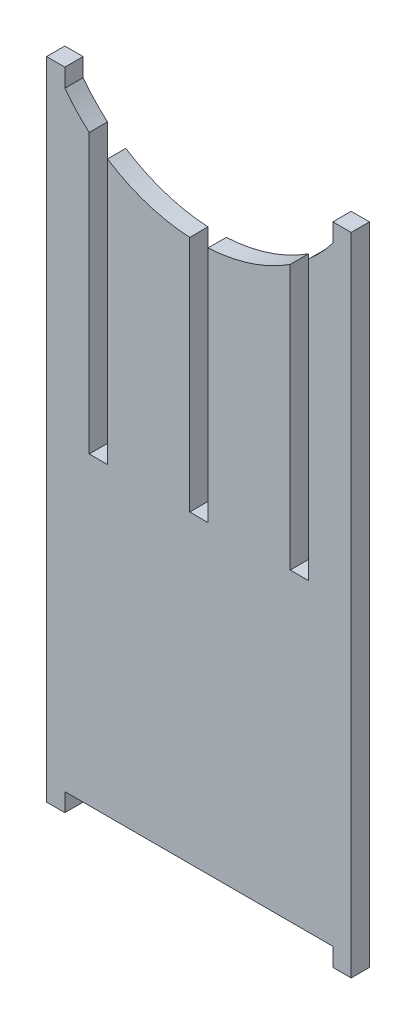
ISO-10303-21;
HEADER;
FILE_DESCRIPTION(('STEP AP214'),'2;1');
FILE_NAME('part.step','',(''),(''),'','','');
FILE_SCHEMA(('AUTOMOTIVE_DESIGN { 1 0 10303 214 1 1 1 1 }'));
ENDSEC;
DATA;
#1=APPLICATION_CONTEXT('core data for automotive mechanical design processes');
#2=APPLICATION_PROTOCOL_DEFINITION('international standard','automotive_design',2000,#1);
#3=PRODUCT_CONTEXT('',#1,'mechanical');
#4=PRODUCT('Part','Part','',(#3));
#5=PRODUCT_RELATED_PRODUCT_CATEGORY('part','',(#4));
#6=PRODUCT_DEFINITION_FORMATION('','',#4);
#7=PRODUCT_DEFINITION_CONTEXT('part definition',#1,'design');
#8=PRODUCT_DEFINITION('design','',#6,#7);
#9=PRODUCT_DEFINITION_SHAPE('','',#8);
#10=(LENGTH_UNIT() NAMED_UNIT(*) SI_UNIT(.MILLI.,.METRE.));
#11=(NAMED_UNIT(*) PLANE_ANGLE_UNIT() SI_UNIT($,.RADIAN.));
#12=(NAMED_UNIT(*) SI_UNIT($,.STERADIAN.) SOLID_ANGLE_UNIT());
#13=UNCERTAINTY_MEASURE_WITH_UNIT(LENGTH_MEASURE(1.E-05),#10,'distance_accuracy_value','');
#14=(GEOMETRIC_REPRESENTATION_CONTEXT(3) GLOBAL_UNCERTAINTY_ASSIGNED_CONTEXT((#13)) GLOBAL_UNIT_ASSIGNED_CONTEXT((#10,
#11,#12)) REPRESENTATION_CONTEXT('',''));
#15=CARTESIAN_POINT('',(0.,0.,0.));
#16=DIRECTION('',(0.,0.,1.));
#17=DIRECTION('',(1.,0.,0.));
#18=AXIS2_PLACEMENT_3D('',#15,#16,#17);
#19=CARTESIAN_POINT('',(-44.,0.,6.));
#20=DIRECTION('',(0.,1.,0.));
#21=DIRECTION('',(-1.,0.,0.));
#22=AXIS2_PLACEMENT_3D('',#19,#20,#21);
#23=PLANE('',#22);
#24=DIRECTION('',(1.,0.,0.));
#25=VECTOR('',#24,1.);
#26=CARTESIAN_POINT('',(-44.,0.,0.));
#27=LINE('',#26,#25);
#28=CARTESIAN_POINT('',(-50.,0.,0.));
#29=VERTEX_POINT('',#28);
#30=CARTESIAN_POINT('',(-44.,0.,0.));
#31=VERTEX_POINT('',#30);
#32=EDGE_CURVE('E351',#29,#31,#27,.T.);
#33=ORIENTED_EDGE('',*,*,#32,.T.);
#34=DIRECTION('',(0.,0.,-1.));
#35=VECTOR('',#34,1.);
#36=CARTESIAN_POINT('',(-44.,0.,6.));
#37=LINE('',#36,#35);
#38=CARTESIAN_POINT('',(-44.,0.,6.));
#39=VERTEX_POINT('',#38);
#40=EDGE_CURVE('E248',#39,#31,#37,.T.);
#41=ORIENTED_EDGE('',*,*,#40,.F.);
#42=DIRECTION('',(1.,0.,0.));
#43=VECTOR('',#42,1.);
#44=CARTESIAN_POINT('',(-44.,0.,6.));
#45=LINE('',#44,#43);
#46=CARTESIAN_POINT('',(-50.,0.,6.));
#47=VERTEX_POINT('',#46);
#48=EDGE_CURVE('E301',#47,#39,#45,.T.);
#49=ORIENTED_EDGE('',*,*,#48,.F.);
#50=DIRECTION('',(0.,0.,-1.));
#51=VECTOR('',#50,1.);
#52=CARTESIAN_POINT('',(-50.,0.,6.));
#53=LINE('',#52,#51);
#54=EDGE_CURVE('E302',#47,#29,#53,.T.);
#55=ORIENTED_EDGE('',*,*,#54,.T.);
#56=EDGE_LOOP('',(#33,#41,#49,#55));
#57=FACE_BOUND('',#56,.T.);
#58=ADVANCED_FACE('F39',(#57),#23,.F.);
#59=CARTESIAN_POINT('',(-44.,5.99999999999999,6.));
#60=DIRECTION('',(-1.,0.,0.));
#61=DIRECTION('',(0.,-1.,0.));
#62=AXIS2_PLACEMENT_3D('',#59,#60,#61);
#63=PLANE('',#62);
#64=DIRECTION('',(0.,1.,0.));
#65=VECTOR('',#64,1.);
#66=CARTESIAN_POINT('',(-44.,5.99999999999999,0.));
#67=LINE('',#66,#65);
#68=CARTESIAN_POINT('',(-44.,5.99999999999999,0.));
#69=VERTEX_POINT('',#68);
#70=EDGE_CURVE('E349',#31,#69,#67,.T.);
#71=ORIENTED_EDGE('',*,*,#70,.T.);
#72=DIRECTION('',(0.,0.,-1.));
#73=VECTOR('',#72,1.);
#74=CARTESIAN_POINT('',(-44.,5.99999999999999,6.));
#75=LINE('',#74,#73);
#76=CARTESIAN_POINT('',(-44.,5.99999999999999,6.));
#77=VERTEX_POINT('',#76);
#78=EDGE_CURVE('E246',#77,#69,#75,.T.);
#79=ORIENTED_EDGE('',*,*,#78,.F.);
#80=DIRECTION('',(0.,1.,0.));
#81=VECTOR('',#80,1.);
#82=CARTESIAN_POINT('',(-44.,5.99999999999999,6.));
#83=LINE('',#82,#81);
#84=EDGE_CURVE('E384',#39,#77,#83,.T.);
#85=ORIENTED_EDGE('',*,*,#84,.F.);
#86=ORIENTED_EDGE('',*,*,#40,.T.);
#87=EDGE_LOOP('',(#71,#79,#85,#86));
#88=FACE_BOUND('',#87,.T.);
#89=ADVANCED_FACE('F413',(#88),#63,.F.);
#90=CARTESIAN_POINT('',(44.,6.00000000000001,6.));
#91=DIRECTION('',(0.,1.,0.));
#92=DIRECTION('',(-1.,0.,0.));
#93=AXIS2_PLACEMENT_3D('',#90,#91,#92);
#94=PLANE('',#93);
#95=DIRECTION('',(1.,0.,0.));
#96=VECTOR('',#95,1.);
#97=CARTESIAN_POINT('',(44.,6.00000000000001,0.));
#98=LINE('',#97,#96);
#99=CARTESIAN_POINT('',(44.,6.00000000000001,0.));
#100=VERTEX_POINT('',#99);
#101=EDGE_CURVE('E347',#69,#100,#98,.T.);
#102=ORIENTED_EDGE('',*,*,#101,.T.);
#103=DIRECTION('',(0.,0.,-1.));
#104=VECTOR('',#103,1.);
#105=CARTESIAN_POINT('',(44.,6.00000000000001,6.));
#106=LINE('',#105,#104);
#107=CARTESIAN_POINT('',(44.,6.00000000000001,6.));
#108=VERTEX_POINT('',#107);
#109=EDGE_CURVE('E243',#108,#100,#106,.T.);
#110=ORIENTED_EDGE('',*,*,#109,.F.);
#111=DIRECTION('',(1.,0.,0.));
#112=VECTOR('',#111,1.);
#113=CARTESIAN_POINT('',(44.,6.00000000000001,6.));
#114=LINE('',#113,#112);
#115=EDGE_CURVE('E382',#77,#108,#114,.T.);
#116=ORIENTED_EDGE('',*,*,#115,.F.);
#117=ORIENTED_EDGE('',*,*,#78,.T.);
#118=EDGE_LOOP('',(#102,#110,#116,#117));
#119=FACE_BOUND('',#118,.T.);
#120=ADVANCED_FACE('F418',(#119),#94,.F.);
#121=CARTESIAN_POINT('',(44.,0.,6.));
#122=DIRECTION('',(1.,0.,0.));
#123=DIRECTION('',(0.,0.,-1.));
#124=AXIS2_PLACEMENT_3D('',#121,#122,#123);
#125=PLANE('',#124);
#126=DIRECTION('',(0.,-1.,0.));
#127=VECTOR('',#126,1.);
#128=CARTESIAN_POINT('',(44.,0.,0.));
#129=LINE('',#128,#127);
#130=CARTESIAN_POINT('',(44.,0.,0.));
#131=VERTEX_POINT('',#130);
#132=EDGE_CURVE('E345',#100,#131,#129,.T.);
#133=ORIENTED_EDGE('',*,*,#132,.T.);
#134=DIRECTION('',(0.,0.,-1.));
#135=VECTOR('',#134,1.);
#136=CARTESIAN_POINT('',(44.,0.,6.));
#137=LINE('',#136,#135);
#138=CARTESIAN_POINT('',(44.,0.,6.));
#139=VERTEX_POINT('',#138);
#140=EDGE_CURVE('E240',#139,#131,#137,.T.);
#141=ORIENTED_EDGE('',*,*,#140,.F.);
#142=DIRECTION('',(0.,-1.,0.));
#143=VECTOR('',#142,1.);
#144=CARTESIAN_POINT('',(44.,0.,6.));
#145=LINE('',#144,#143);
#146=EDGE_CURVE('E380',#108,#139,#145,.T.);
#147=ORIENTED_EDGE('',*,*,#146,.F.);
#148=ORIENTED_EDGE('',*,*,#109,.T.);
#149=EDGE_LOOP('',(#133,#141,#147,#148));
#150=FACE_BOUND('',#149,.T.);
#151=ADVANCED_FACE('F625',(#150),#125,.F.);
#152=CARTESIAN_POINT('',(50.,0.,6.));
#153=DIRECTION('',(0.,1.,0.));
#154=DIRECTION('',(-1.,0.,0.));
#155=AXIS2_PLACEMENT_3D('',#152,#153,#154);
#156=PLANE('',#155);
#157=DIRECTION('',(1.,0.,0.));
#158=VECTOR('',#157,1.);
#159=CARTESIAN_POINT('',(50.,0.,0.));
#160=LINE('',#159,#158);
#161=CARTESIAN_POINT('',(50.,0.,0.));
#162=VERTEX_POINT('',#161);
#163=EDGE_CURVE('E343',#131,#162,#160,.T.);
#164=ORIENTED_EDGE('',*,*,#163,.T.);
#165=DIRECTION('',(0.,0.,-1.));
#166=VECTOR('',#165,1.);
#167=CARTESIAN_POINT('',(50.,0.,6.));
#168=LINE('',#167,#166);
#169=CARTESIAN_POINT('',(50.,0.,6.));
#170=VERTEX_POINT('',#169);
#171=EDGE_CURVE('E237',#170,#162,#168,.T.);
#172=ORIENTED_EDGE('',*,*,#171,.F.);
#173=DIRECTION('',(1.,0.,0.));
#174=VECTOR('',#173,1.);
#175=CARTESIAN_POINT('',(50.,0.,6.));
#176=LINE('',#175,#174);
#177=EDGE_CURVE('E378',#139,#170,#176,.T.);
#178=ORIENTED_EDGE('',*,*,#177,.F.);
#179=ORIENTED_EDGE('',*,*,#140,.T.);
#180=EDGE_LOOP('',(#164,#172,#178,#179));
#181=FACE_BOUND('',#180,.T.);
#182=ADVANCED_FACE('F616',(#181),#156,.F.);
#183=CARTESIAN_POINT('',(50.,212.,6.));
#184=DIRECTION('',(-1.,0.,0.));
#185=DIRECTION('',(0.,0.,1.));
#186=AXIS2_PLACEMENT_3D('',#183,#184,#185);
#187=PLANE('',#186);
#188=DIRECTION('',(0.,1.,0.));
#189=VECTOR('',#188,1.);
#190=CARTESIAN_POINT('',(50.,212.,0.));
#191=LINE('',#190,#189);
#192=CARTESIAN_POINT('',(50.,212.,0.));
#193=VERTEX_POINT('',#192);
#194=EDGE_CURVE('E341',#162,#193,#191,.T.);
#195=ORIENTED_EDGE('',*,*,#194,.T.);
#196=DIRECTION('',(0.,0.,-1.));
#197=VECTOR('',#196,1.);
#198=CARTESIAN_POINT('',(50.,212.,6.));
#199=LINE('',#198,#197);
#200=CARTESIAN_POINT('',(50.,212.,6.));
#201=VERTEX_POINT('',#200);
#202=EDGE_CURVE('E228',#201,#193,#199,.T.);
#203=ORIENTED_EDGE('',*,*,#202,.F.);
#204=DIRECTION('',(0.,1.,0.));
#205=VECTOR('',#204,1.);
#206=CARTESIAN_POINT('',(50.,212.,6.));
#207=LINE('',#206,#205);
#208=EDGE_CURVE('E376',#170,#201,#207,.T.);
#209=ORIENTED_EDGE('',*,*,#208,.F.);
#210=ORIENTED_EDGE('',*,*,#171,.T.);
#211=EDGE_LOOP('',(#195,#203,#209,#210));
#212=FACE_BOUND('',#211,.T.);
#213=ADVANCED_FACE('F607',(#212),#187,.F.);
#214=CARTESIAN_POINT('',(44.,212.,6.));
#215=DIRECTION('',(0.,-1.,0.));
#216=DIRECTION('',(0.,0.,-1.));
#217=AXIS2_PLACEMENT_3D('',#214,#215,#216);
#218=PLANE('',#217);
#219=DIRECTION('',(-1.,0.,0.));
#220=VECTOR('',#219,1.);
#221=CARTESIAN_POINT('',(44.,212.,0.));
#222=LINE('',#221,#220);
#223=CARTESIAN_POINT('',(44.,212.,0.));
#224=VERTEX_POINT('',#223);
#225=EDGE_CURVE('E339',#193,#224,#222,.T.);
#226=ORIENTED_EDGE('',*,*,#225,.T.);
#227=DIRECTION('',(0.,0.,-1.));
#228=VECTOR('',#227,1.);
#229=CARTESIAN_POINT('',(44.,212.,6.));
#230=LINE('',#229,#228);
#231=CARTESIAN_POINT('',(44.,212.,6.));
#232=VERTEX_POINT('',#231);
#233=EDGE_CURVE('E225',#232,#224,#230,.T.);
#234=ORIENTED_EDGE('',*,*,#233,.F.);
#235=DIRECTION('',(-1.,0.,0.));
#236=VECTOR('',#235,1.);
#237=CARTESIAN_POINT('',(44.,212.,6.));
#238=LINE('',#237,#236);
#239=EDGE_CURVE('E215',#201,#232,#238,.T.);
#240=ORIENTED_EDGE('',*,*,#239,.F.);
#241=ORIENTED_EDGE('',*,*,#202,.T.);
#242=EDGE_LOOP('',(#226,#234,#240,#241));
#243=FACE_BOUND('',#242,.T.);
#244=ADVANCED_FACE('F410',(#243),#218,.F.);
#245=CARTESIAN_POINT('',(44.,206.,6.));
#246=DIRECTION('',(1.,0.,0.));
#247=DIRECTION('',(0.,0.,-1.));
#248=AXIS2_PLACEMENT_3D('',#245,#246,#247);
#249=PLANE('',#248);
#250=DIRECTION('',(0.,-1.,0.));
#251=VECTOR('',#250,1.);
#252=CARTESIAN_POINT('',(44.,206.,0.));
#253=LINE('',#252,#251);
#254=CARTESIAN_POINT('',(44.,206.,0.));
#255=VERTEX_POINT('',#254);
#256=EDGE_CURVE('E224',#224,#255,#253,.T.);
#257=ORIENTED_EDGE('',*,*,#256,.T.);
#258=DIRECTION('',(0.,0.,-1.));
#259=VECTOR('',#258,1.);
#260=CARTESIAN_POINT('',(44.,206.,6.));
#261=LINE('',#260,#259);
#262=CARTESIAN_POINT('',(44.,206.,6.));
#263=VERTEX_POINT('',#262);
#264=EDGE_CURVE('E202',#263,#255,#261,.T.);
#265=ORIENTED_EDGE('',*,*,#264,.F.);
#266=DIRECTION('',(0.,-1.,0.));
#267=VECTOR('',#266,1.);
#268=CARTESIAN_POINT('',(44.,206.,6.));
#269=LINE('',#268,#267);
#270=EDGE_CURVE('E212',#232,#263,#269,.T.);
#271=ORIENTED_EDGE('',*,*,#270,.F.);
#272=ORIENTED_EDGE('',*,*,#233,.T.);
#273=EDGE_LOOP('',(#257,#265,#271,#272));
#274=FACE_BOUND('',#273,.T.);
#275=ADVANCED_FACE('F222',(#274),#249,.F.);
#276=CARTESIAN_POINT('',(36.,106.,6.));
#277=DIRECTION('',(1.,0.,0.));
#278=DIRECTION('',(0.,0.,-1.));
#279=AXIS2_PLACEMENT_3D('',#276,#277,#278);
#280=PLANE('',#279);
#281=DIRECTION('',(0.,-1.,0.));
#282=VECTOR('',#281,1.);
#283=CARTESIAN_POINT('',(36.,106.,6.));
#284=LINE('',#283,#282);
#285=CARTESIAN_POINT('',(36.,197.418754227416,6.));
#286=VERTEX_POINT('',#285);
#287=CARTESIAN_POINT('',(36.,106.,6.));
#288=VERTEX_POINT('',#287);
#289=EDGE_CURVE('E219',#286,#288,#284,.T.);
#290=ORIENTED_EDGE('',*,*,#289,.F.);
#291=DIRECTION('',(0.,0.,1.));
#292=VECTOR('',#291,1.);
#293=CARTESIAN_POINT('',(36.,197.418754227416,-4.));
#294=LINE('',#293,#292);
#295=CARTESIAN_POINT('',(36.,197.418754227416,0.));
#296=VERTEX_POINT('',#295);
#297=EDGE_CURVE('E205',#286,#296,#294,.F.);
#298=ORIENTED_EDGE('',*,*,#297,.T.);
#299=DIRECTION('',(0.,-1.,0.));
#300=VECTOR('',#299,1.);
#301=CARTESIAN_POINT('',(36.,106.,0.));
#302=LINE('',#301,#300);
#303=CARTESIAN_POINT('',(36.,106.,0.));
#304=VERTEX_POINT('',#303);
#305=EDGE_CURVE('E335',#296,#304,#302,.T.);
#306=ORIENTED_EDGE('',*,*,#305,.T.);
#307=DIRECTION('',(0.,0.,-1.));
#308=VECTOR('',#307,1.);
#309=CARTESIAN_POINT('',(36.,106.,6.));
#310=LINE('',#309,#308);
#311=EDGE_CURVE('E226',#288,#304,#310,.T.);
#312=ORIENTED_EDGE('',*,*,#311,.F.);
#313=EDGE_LOOP('',(#290,#298,#306,#312));
#314=FACE_BOUND('',#313,.T.);
#315=ADVANCED_FACE('F401',(#314),#280,.F.);
#316=CARTESIAN_POINT('',(30.,106.,6.));
#317=DIRECTION('',(0.,-1.,0.));
#318=DIRECTION('',(0.,0.,-1.));
#319=AXIS2_PLACEMENT_3D('',#316,#317,#318);
#320=PLANE('',#319);
#321=DIRECTION('',(-1.,0.,0.));
#322=VECTOR('',#321,1.);
#323=CARTESIAN_POINT('',(30.,106.,0.));
#324=LINE('',#323,#322);
#325=CARTESIAN_POINT('',(30.,106.,0.));
#326=VERTEX_POINT('',#325);
#327=EDGE_CURVE('E282',#304,#326,#324,.T.);
#328=ORIENTED_EDGE('',*,*,#327,.T.);
#329=DIRECTION('',(0.,0.,-1.));
#330=VECTOR('',#329,1.);
#331=CARTESIAN_POINT('',(30.,106.,6.));
#332=LINE('',#331,#330);
#333=CARTESIAN_POINT('',(30.,106.,6.));
#334=VERTEX_POINT('',#333);
#335=EDGE_CURVE('E231',#334,#326,#332,.T.);
#336=ORIENTED_EDGE('',*,*,#335,.F.);
#337=DIRECTION('',(-1.,0.,0.));
#338=VECTOR('',#337,1.);
#339=CARTESIAN_POINT('',(30.,106.,6.));
#340=LINE('',#339,#338);
#341=EDGE_CURVE('E372',#288,#334,#340,.T.);
#342=ORIENTED_EDGE('',*,*,#341,.F.);
#343=ORIENTED_EDGE('',*,*,#311,.T.);
#344=EDGE_LOOP('',(#328,#336,#342,#343));
#345=FACE_BOUND('',#344,.T.);
#346=ADVANCED_FACE('F399',(#345),#320,.F.);
#347=CARTESIAN_POINT('',(30.,206.,6.));
#348=DIRECTION('',(-1.,0.,0.));
#349=DIRECTION('',(0.,-1.,0.));
#350=AXIS2_PLACEMENT_3D('',#347,#348,#349);
#351=PLANE('',#350);
#352=DIRECTION('',(0.,1.,0.));
#353=VECTOR('',#352,1.);
#354=CARTESIAN_POINT('',(30.,206.,0.));
#355=LINE('',#354,#353);
#356=CARTESIAN_POINT('',(30.,192.902277713536,0.));
#357=VERTEX_POINT('',#356);
#358=EDGE_CURVE('E278',#326,#357,#355,.T.);
#359=ORIENTED_EDGE('',*,*,#358,.T.);
#360=DIRECTION('',(0.,0.,1.));
#361=VECTOR('',#360,1.);
#362=CARTESIAN_POINT('',(30.,192.902277713536,-4.));
#363=LINE('',#362,#361);
#364=CARTESIAN_POINT('',(30.,192.902277713536,6.));
#365=VERTEX_POINT('',#364);
#366=EDGE_CURVE('E54',#357,#365,#363,.T.);
#367=ORIENTED_EDGE('',*,*,#366,.T.);
#368=DIRECTION('',(0.,1.,0.));
#369=VECTOR('',#368,1.);
#370=CARTESIAN_POINT('',(30.,206.,6.));
#371=LINE('',#370,#369);
#372=EDGE_CURVE('E330',#334,#365,#371,.T.);
#373=ORIENTED_EDGE('',*,*,#372,.F.);
#374=ORIENTED_EDGE('',*,*,#335,.T.);
#375=EDGE_LOOP('',(#359,#367,#373,#374));
#376=FACE_BOUND('',#375,.T.);
#377=ADVANCED_FACE('F328',(#376),#351,.F.);
#378=CARTESIAN_POINT('',(3.,106.,6.));
#379=DIRECTION('',(1.,0.,0.));
#380=DIRECTION('',(0.,1.,0.));
#381=AXIS2_PLACEMENT_3D('',#378,#379,#380);
#382=PLANE('',#381);
#383=DIRECTION('',(0.,-1.,0.));
#384=VECTOR('',#383,1.);
#385=CARTESIAN_POINT('',(3.,106.,6.));
#386=LINE('',#385,#384);
#387=CARTESIAN_POINT('',(2.99999999999999,184.081879129016,6.));
#388=VERTEX_POINT('',#387);
#389=CARTESIAN_POINT('',(3.,106.,6.));
#390=VERTEX_POINT('',#389);
#391=EDGE_CURVE('E272',#388,#390,#386,.T.);
#392=ORIENTED_EDGE('',*,*,#391,.F.);
#393=DIRECTION('',(0.,0.,1.));
#394=VECTOR('',#393,1.);
#395=CARTESIAN_POINT('',(2.99999999999999,184.081879129016,-4.));
#396=LINE('',#395,#394);
#397=CARTESIAN_POINT('',(2.99999999999999,184.081879129016,0.));
#398=VERTEX_POINT('',#397);
#399=EDGE_CURVE('E260',#388,#398,#396,.F.);
#400=ORIENTED_EDGE('',*,*,#399,.T.);
#401=DIRECTION('',(0.,-1.,0.));
#402=VECTOR('',#401,1.);
#403=CARTESIAN_POINT('',(3.,106.,0.));
#404=LINE('',#403,#402);
#405=CARTESIAN_POINT('',(3.,106.,0.));
#406=VERTEX_POINT('',#405);
#407=EDGE_CURVE('E270',#398,#406,#404,.T.);
#408=ORIENTED_EDGE('',*,*,#407,.T.);
#409=DIRECTION('',(0.,0.,-1.));
#410=VECTOR('',#409,1.);
#411=CARTESIAN_POINT('',(3.,106.,6.));
#412=LINE('',#411,#410);
#413=EDGE_CURVE('E323',#390,#406,#412,.T.);
#414=ORIENTED_EDGE('',*,*,#413,.F.);
#415=EDGE_LOOP('',(#392,#400,#408,#414));
#416=FACE_BOUND('',#415,.T.);
#417=ADVANCED_FACE('F268',(#416),#382,.F.);
#418=CARTESIAN_POINT('',(-3.,106.,6.));
#419=DIRECTION('',(0.,-1.,0.));
#420=DIRECTION('',(0.,0.,-1.));
#421=AXIS2_PLACEMENT_3D('',#418,#419,#420);
#422=PLANE('',#421);
#423=DIRECTION('',(-1.,0.,0.));
#424=VECTOR('',#423,1.);
#425=CARTESIAN_POINT('',(-3.,106.,0.));
#426=LINE('',#425,#424);
#427=CARTESIAN_POINT('',(-3.,106.,0.));
#428=VERTEX_POINT('',#427);
#429=EDGE_CURVE('E277',#406,#428,#426,.T.);
#430=ORIENTED_EDGE('',*,*,#429,.T.);
#431=DIRECTION('',(0.,0.,-1.));
#432=VECTOR('',#431,1.);
#433=CARTESIAN_POINT('',(-3.,106.,6.));
#434=LINE('',#433,#432);
#435=CARTESIAN_POINT('',(-3.,106.,6.));
#436=VERTEX_POINT('',#435);
#437=EDGE_CURVE('E320',#436,#428,#434,.T.);
#438=ORIENTED_EDGE('',*,*,#437,.F.);
#439=DIRECTION('',(-1.,0.,0.));
#440=VECTOR('',#439,1.);
#441=CARTESIAN_POINT('',(-3.,106.,6.));
#442=LINE('',#441,#440);
#443=EDGE_CURVE('E368',#390,#436,#442,.T.);
#444=ORIENTED_EDGE('',*,*,#443,.F.);
#445=ORIENTED_EDGE('',*,*,#413,.T.);
#446=EDGE_LOOP('',(#430,#438,#444,#445));
#447=FACE_BOUND('',#446,.T.);
#448=ADVANCED_FACE('F466',(#447),#422,.F.);
#449=CARTESIAN_POINT('',(-3.00000000000002,206.,6.));
#450=DIRECTION('',(-1.,0.,0.));
#451=DIRECTION('',(0.,-1.,0.));
#452=AXIS2_PLACEMENT_3D('',#449,#450,#451);
#453=PLANE('',#452);
#454=DIRECTION('',(0.,1.,0.));
#455=VECTOR('',#454,1.);
#456=CARTESIAN_POINT('',(-3.00000000000002,206.,0.));
#457=LINE('',#456,#455);
#458=CARTESIAN_POINT('',(-3.00000000000001,184.081879129016,0.));
#459=VERTEX_POINT('',#458);
#460=EDGE_CURVE('E280',#428,#459,#457,.T.);
#461=ORIENTED_EDGE('',*,*,#460,.T.);
#462=DIRECTION('',(0.,0.,1.));
#463=VECTOR('',#462,1.);
#464=CARTESIAN_POINT('',(-3.00000000000001,184.081879129016,-4.));
#465=LINE('',#464,#463);
#466=CARTESIAN_POINT('',(-3.00000000000001,184.081879129016,6.));
#467=VERTEX_POINT('',#466);
#468=EDGE_CURVE('E62',#459,#467,#465,.T.);
#469=ORIENTED_EDGE('',*,*,#468,.T.);
#470=DIRECTION('',(0.,1.,0.));
#471=VECTOR('',#470,1.);
#472=CARTESIAN_POINT('',(-3.00000000000002,206.,6.));
#473=LINE('',#472,#471);
#474=EDGE_CURVE('E365',#436,#467,#473,.T.);
#475=ORIENTED_EDGE('',*,*,#474,.F.);
#476=ORIENTED_EDGE('',*,*,#437,.T.);
#477=EDGE_LOOP('',(#461,#469,#475,#476));
#478=FACE_BOUND('',#477,.T.);
#479=ADVANCED_FACE('F464',(#478),#453,.F.);
#480=CARTESIAN_POINT('',(-30.,106.,6.));
#481=DIRECTION('',(1.,0.,0.));
#482=DIRECTION('',(0.,0.,-1.));
#483=AXIS2_PLACEMENT_3D('',#480,#481,#482);
#484=PLANE('',#483);
#485=DIRECTION('',(0.,-1.,0.));
#486=VECTOR('',#485,1.);
#487=CARTESIAN_POINT('',(-30.,106.,6.));
#488=LINE('',#487,#486);
#489=CARTESIAN_POINT('',(-30.,192.902277713536,6.));
#490=VERTEX_POINT('',#489);
#491=CARTESIAN_POINT('',(-30.,106.,6.));
#492=VERTEX_POINT('',#491);
#493=EDGE_CURVE('E363',#490,#492,#488,.T.);
#494=ORIENTED_EDGE('',*,*,#493,.F.);
#495=DIRECTION('',(0.,0.,1.));
#496=VECTOR('',#495,1.);
#497=CARTESIAN_POINT('',(-30.,192.902277713536,-4.));
#498=LINE('',#497,#496);
#499=CARTESIAN_POINT('',(-30.,192.902277713536,0.));
#500=VERTEX_POINT('',#499);
#501=EDGE_CURVE('E391',#490,#500,#498,.F.);
#502=ORIENTED_EDGE('',*,*,#501,.T.);
#503=DIRECTION('',(0.,-1.,0.));
#504=VECTOR('',#503,1.);
#505=CARTESIAN_POINT('',(-30.,106.,0.));
#506=LINE('',#505,#504);
#507=CARTESIAN_POINT('',(-30.,106.,0.));
#508=VERTEX_POINT('',#507);
#509=EDGE_CURVE('E288',#500,#508,#506,.T.);
#510=ORIENTED_EDGE('',*,*,#509,.T.);
#511=DIRECTION('',(0.,0.,-1.));
#512=VECTOR('',#511,1.);
#513=CARTESIAN_POINT('',(-30.,106.,6.));
#514=LINE('',#513,#512);
#515=EDGE_CURVE('E317',#492,#508,#514,.T.);
#516=ORIENTED_EDGE('',*,*,#515,.F.);
#517=EDGE_LOOP('',(#494,#502,#510,#516));
#518=FACE_BOUND('',#517,.T.);
#519=ADVANCED_FACE('F458',(#518),#484,.F.);
#520=CARTESIAN_POINT('',(-36.,106.,6.));
#521=DIRECTION('',(0.,-1.,0.));
#522=DIRECTION('',(0.,0.,-1.));
#523=AXIS2_PLACEMENT_3D('',#520,#521,#522);
#524=PLANE('',#523);
#525=DIRECTION('',(-1.,0.,0.));
#526=VECTOR('',#525,1.);
#527=CARTESIAN_POINT('',(-36.,106.,0.));
#528=LINE('',#527,#526);
#529=CARTESIAN_POINT('',(-36.,106.,0.));
#530=VERTEX_POINT('',#529);
#531=EDGE_CURVE('E290',#508,#530,#528,.T.);
#532=ORIENTED_EDGE('',*,*,#531,.T.);
#533=DIRECTION('',(0.,0.,-1.));
#534=VECTOR('',#533,1.);
#535=CARTESIAN_POINT('',(-36.,106.,6.));
#536=LINE('',#535,#534);
#537=CARTESIAN_POINT('',(-36.,106.,6.));
#538=VERTEX_POINT('',#537);
#539=EDGE_CURVE('E314',#538,#530,#536,.T.);
#540=ORIENTED_EDGE('',*,*,#539,.F.);
#541=DIRECTION('',(-1.,0.,0.));
#542=VECTOR('',#541,1.);
#543=CARTESIAN_POINT('',(-36.,106.,6.));
#544=LINE('',#543,#542);
#545=EDGE_CURVE('E361',#492,#538,#544,.T.);
#546=ORIENTED_EDGE('',*,*,#545,.F.);
#547=ORIENTED_EDGE('',*,*,#515,.T.);
#548=EDGE_LOOP('',(#532,#540,#546,#547));
#549=FACE_BOUND('',#548,.T.);
#550=ADVANCED_FACE('F454',(#549),#524,.F.);
#551=CARTESIAN_POINT('',(-36.,206.,6.));
#552=DIRECTION('',(-1.,0.,0.));
#553=DIRECTION('',(0.,0.,1.));
#554=AXIS2_PLACEMENT_3D('',#551,#552,#553);
#555=PLANE('',#554);
#556=DIRECTION('',(0.,1.,0.));
#557=VECTOR('',#556,1.);
#558=CARTESIAN_POINT('',(-36.,206.,0.));
#559=LINE('',#558,#557);
#560=CARTESIAN_POINT('',(-36.,197.418754227416,0.));
#561=VERTEX_POINT('',#560);
#562=EDGE_CURVE('E292',#530,#561,#559,.T.);
#563=ORIENTED_EDGE('',*,*,#562,.T.);
#564=DIRECTION('',(0.,0.,1.));
#565=VECTOR('',#564,1.);
#566=CARTESIAN_POINT('',(-36.,197.418754227416,-4.));
#567=LINE('',#566,#565);
#568=CARTESIAN_POINT('',(-36.,197.418754227416,6.));
#569=VERTEX_POINT('',#568);
#570=EDGE_CURVE('E393',#561,#569,#567,.T.);
#571=ORIENTED_EDGE('',*,*,#570,.T.);
#572=DIRECTION('',(0.,1.,0.));
#573=VECTOR('',#572,1.);
#574=CARTESIAN_POINT('',(-36.,206.,6.));
#575=LINE('',#574,#573);
#576=EDGE_CURVE('E358',#538,#569,#575,.T.);
#577=ORIENTED_EDGE('',*,*,#576,.F.);
#578=ORIENTED_EDGE('',*,*,#539,.T.);
#579=EDGE_LOOP('',(#563,#571,#577,#578));
#580=FACE_BOUND('',#579,.T.);
#581=ADVANCED_FACE('F450',(#580),#555,.F.);
#582=CARTESIAN_POINT('',(-44.,212.,6.));
#583=DIRECTION('',(-1.,0.,0.));
#584=DIRECTION('',(0.,0.,1.));
#585=AXIS2_PLACEMENT_3D('',#582,#583,#584);
#586=PLANE('',#585);
#587=DIRECTION('',(0.,1.,0.));
#588=VECTOR('',#587,1.);
#589=CARTESIAN_POINT('',(-44.,212.,0.));
#590=LINE('',#589,#588);
#591=CARTESIAN_POINT('',(-44.,206.,0.));
#592=VERTEX_POINT('',#591);
#593=CARTESIAN_POINT('',(-44.,212.,0.));
#594=VERTEX_POINT('',#593);
#595=EDGE_CURVE('E295',#592,#594,#590,.T.);
#596=ORIENTED_EDGE('',*,*,#595,.T.);
#597=DIRECTION('',(0.,0.,-1.));
#598=VECTOR('',#597,1.);
#599=CARTESIAN_POINT('',(-44.,212.,6.));
#600=LINE('',#599,#598);
#601=CARTESIAN_POINT('',(-44.,212.,6.));
#602=VERTEX_POINT('',#601);
#603=EDGE_CURVE('E309',#602,#594,#600,.T.);
#604=ORIENTED_EDGE('',*,*,#603,.F.);
#605=DIRECTION('',(0.,1.,0.));
#606=VECTOR('',#605,1.);
#607=CARTESIAN_POINT('',(-44.,212.,6.));
#608=LINE('',#607,#606);
#609=CARTESIAN_POINT('',(-44.,206.,6.));
#610=VERTEX_POINT('',#609);
#611=EDGE_CURVE('E356',#610,#602,#608,.T.);
#612=ORIENTED_EDGE('',*,*,#611,.F.);
#613=DIRECTION('',(0.,0.,-1.));
#614=VECTOR('',#613,1.);
#615=CARTESIAN_POINT('',(-44.,206.,6.));
#616=LINE('',#615,#614);
#617=EDGE_CURVE('E312',#610,#592,#616,.T.);
#618=ORIENTED_EDGE('',*,*,#617,.T.);
#619=EDGE_LOOP('',(#596,#604,#612,#618));
#620=FACE_BOUND('',#619,.T.);
#621=ADVANCED_FACE('F443',(#620),#586,.F.);
#622=CARTESIAN_POINT('',(-50.,212.,6.));
#623=DIRECTION('',(0.,-1.,0.));
#624=DIRECTION('',(0.,0.,-1.));
#625=AXIS2_PLACEMENT_3D('',#622,#623,#624);
#626=PLANE('',#625);
#627=DIRECTION('',(-1.,0.,0.));
#628=VECTOR('',#627,1.);
#629=CARTESIAN_POINT('',(-50.,212.,0.));
#630=LINE('',#629,#628);
#631=CARTESIAN_POINT('',(-50.,212.,0.));
#632=VERTEX_POINT('',#631);
#633=EDGE_CURVE('E297',#594,#632,#630,.T.);
#634=ORIENTED_EDGE('',*,*,#633,.T.);
#635=DIRECTION('',(0.,0.,-1.));
#636=VECTOR('',#635,1.);
#637=CARTESIAN_POINT('',(-50.,212.,6.));
#638=LINE('',#637,#636);
#639=CARTESIAN_POINT('',(-50.,212.,6.));
#640=VERTEX_POINT('',#639);
#641=EDGE_CURVE('E305',#640,#632,#638,.T.);
#642=ORIENTED_EDGE('',*,*,#641,.F.);
#643=DIRECTION('',(-1.,0.,0.));
#644=VECTOR('',#643,1.);
#645=CARTESIAN_POINT('',(-50.,212.,6.));
#646=LINE('',#645,#644);
#647=EDGE_CURVE('E354',#602,#640,#646,.T.);
#648=ORIENTED_EDGE('',*,*,#647,.F.);
#649=ORIENTED_EDGE('',*,*,#603,.T.);
#650=EDGE_LOOP('',(#634,#642,#648,#649));
#651=FACE_BOUND('',#650,.T.);
#652=ADVANCED_FACE('F438',(#651),#626,.F.);
#653=CARTESIAN_POINT('',(-50.,0.,6.));
#654=DIRECTION('',(1.,0.,0.));
#655=DIRECTION('',(0.,0.,-1.));
#656=AXIS2_PLACEMENT_3D('',#653,#654,#655);
#657=PLANE('',#656);
#658=DIRECTION('',(0.,-1.,0.));
#659=VECTOR('',#658,1.);
#660=CARTESIAN_POINT('',(-50.,0.,0.));
#661=LINE('',#660,#659);
#662=EDGE_CURVE('E299',#632,#29,#661,.T.);
#663=ORIENTED_EDGE('',*,*,#662,.T.);
#664=ORIENTED_EDGE('',*,*,#54,.F.);
#665=DIRECTION('',(0.,-1.,0.));
#666=VECTOR('',#665,1.);
#667=CARTESIAN_POINT('',(-50.,0.,6.));
#668=LINE('',#667,#666);
#669=EDGE_CURVE('E306',#640,#47,#668,.T.);
#670=ORIENTED_EDGE('',*,*,#669,.F.);
#671=ORIENTED_EDGE('',*,*,#641,.T.);
#672=EDGE_LOOP('',(#663,#664,#670,#671));
#673=FACE_BOUND('',#672,.T.);
#674=ADVANCED_FACE('F436',(#673),#657,.F.);
#675=CARTESIAN_POINT('',(0.,0.,6.));
#676=DIRECTION('',(0.,0.,-1.));
#677=DIRECTION('',(-1.,0.,0.));
#678=AXIS2_PLACEMENT_3D('',#675,#676,#677);
#679=PLANE('',#678);
#680=ORIENTED_EDGE('',*,*,#270,.T.);
#681=CARTESIAN_POINT('',(0.,239.,6.));
#682=DIRECTION('',(0.,0.,1.));
#683=DIRECTION('',(1.,0.,0.));
#684=AXIS2_PLACEMENT_3D('',#681,#682,#683);
#685=CIRCLE('',#684,55.);
#686=EDGE_CURVE('E198',#286,#263,#685,.T.);
#687=ORIENTED_EDGE('',*,*,#686,.F.);
#688=ORIENTED_EDGE('',*,*,#289,.T.);
#689=ORIENTED_EDGE('',*,*,#341,.T.);
#690=ORIENTED_EDGE('',*,*,#372,.T.);
#691=EDGE_CURVE('E208',#388,#365,#685,.T.);
#692=ORIENTED_EDGE('',*,*,#691,.F.);
#693=ORIENTED_EDGE('',*,*,#391,.T.);
#694=ORIENTED_EDGE('',*,*,#443,.T.);
#695=ORIENTED_EDGE('',*,*,#474,.T.);
#696=EDGE_CURVE('E395',#490,#467,#685,.T.);
#697=ORIENTED_EDGE('',*,*,#696,.F.);
#698=ORIENTED_EDGE('',*,*,#493,.T.);
#699=ORIENTED_EDGE('',*,*,#545,.T.);
#700=ORIENTED_EDGE('',*,*,#576,.T.);
#701=EDGE_CURVE('E210',#610,#569,#685,.T.);
#702=ORIENTED_EDGE('',*,*,#701,.F.);
#703=ORIENTED_EDGE('',*,*,#611,.T.);
#704=ORIENTED_EDGE('',*,*,#647,.T.);
#705=ORIENTED_EDGE('',*,*,#669,.T.);
#706=ORIENTED_EDGE('',*,*,#48,.T.);
#707=ORIENTED_EDGE('',*,*,#84,.T.);
#708=ORIENTED_EDGE('',*,*,#115,.T.);
#709=ORIENTED_EDGE('',*,*,#146,.T.);
#710=ORIENTED_EDGE('',*,*,#177,.T.);
#711=ORIENTED_EDGE('',*,*,#208,.T.);
#712=ORIENTED_EDGE('',*,*,#239,.T.);
#713=EDGE_LOOP('',(#680,#687,#688,#689,#690,#692,#693,#694,#695,#697,#698,#699,#700,#702,#703,
#704,#705,#706,#707,#708,#709,#710,#711,#712));
#714=FACE_BOUND('',#713,.T.);
#715=ADVANCED_FACE('F213',(#714),#679,.F.);
#716=CARTESIAN_POINT('',(0.,0.,0.));
#717=DIRECTION('',(0.,0.,-1.));
#718=DIRECTION('',(-1.,0.,0.));
#719=AXIS2_PLACEMENT_3D('',#716,#717,#718);
#720=PLANE('',#719);
#721=CARTESIAN_POINT('',(0.,239.,0.));
#722=DIRECTION('',(0.,0.,-1.));
#723=DIRECTION('',(-1.,0.,0.));
#724=AXIS2_PLACEMENT_3D('',#721,#722,#723);
#725=CIRCLE('',#724,55.);
#726=EDGE_CURVE('E11',#255,#296,#725,.T.);
#727=ORIENTED_EDGE('',*,*,#726,.F.);
#728=ORIENTED_EDGE('',*,*,#256,.F.);
#729=ORIENTED_EDGE('',*,*,#225,.F.);
#730=ORIENTED_EDGE('',*,*,#194,.F.);
#731=ORIENTED_EDGE('',*,*,#163,.F.);
#732=ORIENTED_EDGE('',*,*,#132,.F.);
#733=ORIENTED_EDGE('',*,*,#101,.F.);
#734=ORIENTED_EDGE('',*,*,#70,.F.);
#735=ORIENTED_EDGE('',*,*,#32,.F.);
#736=ORIENTED_EDGE('',*,*,#662,.F.);
#737=ORIENTED_EDGE('',*,*,#633,.F.);
#738=ORIENTED_EDGE('',*,*,#595,.F.);
#739=EDGE_CURVE('E42',#561,#592,#725,.T.);
#740=ORIENTED_EDGE('',*,*,#739,.F.);
#741=ORIENTED_EDGE('',*,*,#562,.F.);
#742=ORIENTED_EDGE('',*,*,#531,.F.);
#743=ORIENTED_EDGE('',*,*,#509,.F.);
#744=EDGE_CURVE('E253',#459,#500,#725,.T.);
#745=ORIENTED_EDGE('',*,*,#744,.F.);
#746=ORIENTED_EDGE('',*,*,#460,.F.);
#747=ORIENTED_EDGE('',*,*,#429,.F.);
#748=ORIENTED_EDGE('',*,*,#407,.F.);
#749=EDGE_CURVE('E47',#357,#398,#725,.T.);
#750=ORIENTED_EDGE('',*,*,#749,.F.);
#751=ORIENTED_EDGE('',*,*,#358,.F.);
#752=ORIENTED_EDGE('',*,*,#327,.F.);
#753=ORIENTED_EDGE('',*,*,#305,.F.);
#754=EDGE_LOOP('',(#727,#728,#729,#730,#731,#732,#733,#734,#735,#736,#737,#738,#740,#741,#742,
#743,#745,#746,#747,#748,#750,#751,#752,#753));
#755=FACE_BOUND('',#754,.T.);
#756=ADVANCED_FACE('F275',(#755),#720,.T.);
#757=CARTESIAN_POINT('',(0.,239.,-4.));
#758=DIRECTION('',(0.,0.,1.));
#759=DIRECTION('',(1.,0.,0.));
#760=AXIS2_PLACEMENT_3D('',#757,#758,#759);
#761=CYLINDRICAL_SURFACE('',#760,55.);
#762=ORIENTED_EDGE('',*,*,#739,.T.);
#763=ORIENTED_EDGE('',*,*,#617,.F.);
#764=ORIENTED_EDGE('',*,*,#701,.T.);
#765=ORIENTED_EDGE('',*,*,#570,.F.);
#766=EDGE_LOOP('',(#762,#763,#764,#765));
#767=FACE_BOUND('',#766,.T.);
#768=ADVANCED_FACE('F445',(#767),#761,.F.);
#769=ORIENTED_EDGE('',*,*,#744,.T.);
#770=ORIENTED_EDGE('',*,*,#501,.F.);
#771=ORIENTED_EDGE('',*,*,#696,.T.);
#772=ORIENTED_EDGE('',*,*,#468,.F.);
#773=EDGE_LOOP('',(#769,#770,#771,#772));
#774=FACE_BOUND('',#773,.T.);
#775=ADVANCED_FACE('F459',(#774),#761,.F.);
#776=ORIENTED_EDGE('',*,*,#749,.T.);
#777=ORIENTED_EDGE('',*,*,#399,.F.);
#778=ORIENTED_EDGE('',*,*,#691,.T.);
#779=ORIENTED_EDGE('',*,*,#366,.F.);
#780=EDGE_LOOP('',(#776,#777,#778,#779));
#781=FACE_BOUND('',#780,.T.);
#782=ADVANCED_FACE('F259',(#781),#761,.F.);
#783=ORIENTED_EDGE('',*,*,#686,.T.);
#784=ORIENTED_EDGE('',*,*,#264,.T.);
#785=ORIENTED_EDGE('',*,*,#726,.T.);
#786=ORIENTED_EDGE('',*,*,#297,.F.);
#787=EDGE_LOOP('',(#783,#784,#785,#786));
#788=FACE_BOUND('',#787,.T.);
#789=ADVANCED_FACE('F200',(#788),#761,.F.);
#790=CLOSED_SHELL('',(#58,#89,#120,#151,#182,#213,#244,#275,#315,#346,#377,#417,#448,#479,#519,
#550,#581,#621,#652,#674,#715,#756,#768,#775,#782,#789));
#791=MANIFOLD_SOLID_BREP('B2',#790);
#792=ADVANCED_BREP_SHAPE_REPRESENTATION('',(#18,#791),#14);
#793=SHAPE_DEFINITION_REPRESENTATION(#9,#792);
ENDSEC;
END-ISO-10303-21;
